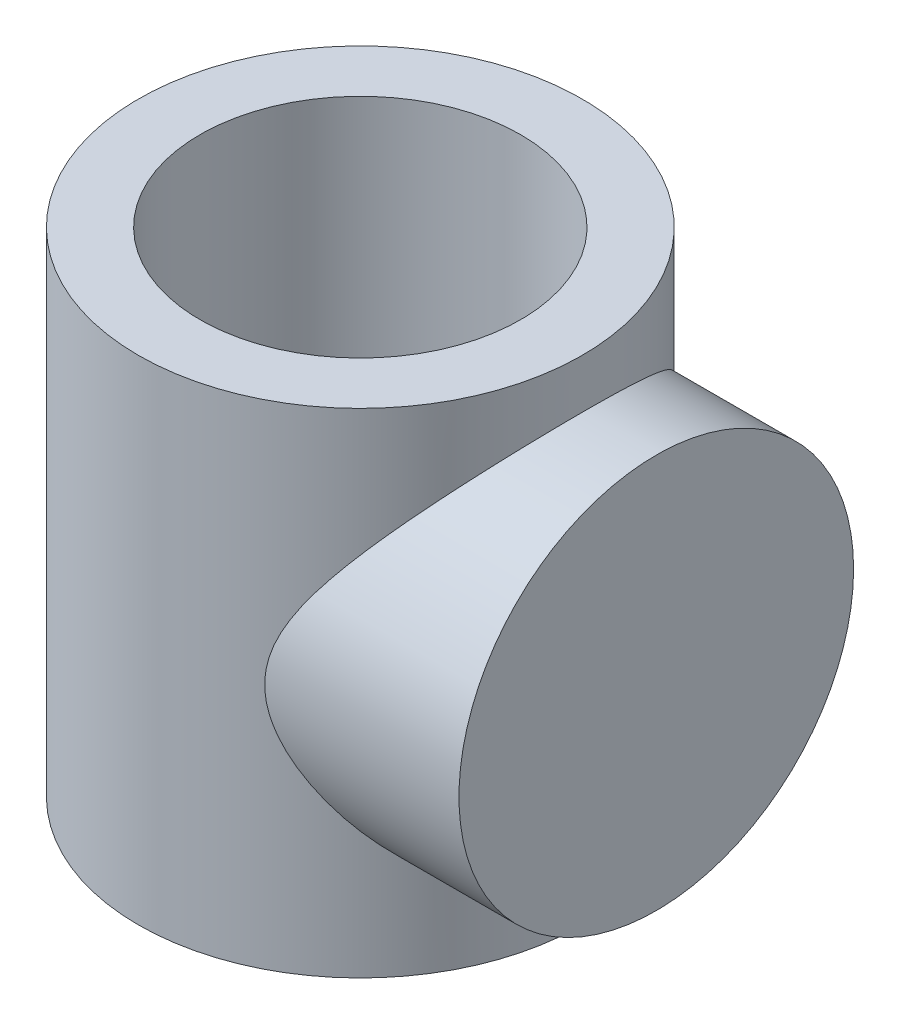
ISO-10303-21;
HEADER;
FILE_DESCRIPTION(('STEP AP214'),'2;1');
FILE_NAME('part.step','',(''),(''),'','','');
FILE_SCHEMA(('AUTOMOTIVE_DESIGN { 1 0 10303 214 1 1 1 1 }'));
ENDSEC;
DATA;
#1=APPLICATION_CONTEXT('core data for automotive mechanical design processes');
#2=APPLICATION_PROTOCOL_DEFINITION('international standard','automotive_design',2000,#1);
#3=PRODUCT_CONTEXT('',#1,'mechanical');
#4=PRODUCT('Part','Part','',(#3));
#5=PRODUCT_RELATED_PRODUCT_CATEGORY('part','',(#4));
#6=PRODUCT_DEFINITION_FORMATION('','',#4);
#7=PRODUCT_DEFINITION_CONTEXT('part definition',#1,'design');
#8=PRODUCT_DEFINITION('design','',#6,#7);
#9=PRODUCT_DEFINITION_SHAPE('','',#8);
#10=(LENGTH_UNIT() NAMED_UNIT(*) SI_UNIT(.MILLI.,.METRE.));
#11=(NAMED_UNIT(*) PLANE_ANGLE_UNIT() SI_UNIT($,.RADIAN.));
#12=(NAMED_UNIT(*) SI_UNIT($,.STERADIAN.) SOLID_ANGLE_UNIT());
#13=UNCERTAINTY_MEASURE_WITH_UNIT(LENGTH_MEASURE(1.E-05),#10,'distance_accuracy_value','');
#14=(GEOMETRIC_REPRESENTATION_CONTEXT(3) GLOBAL_UNCERTAINTY_ASSIGNED_CONTEXT((#13)) GLOBAL_UNIT_ASSIGNED_CONTEXT((#10,
#11,#12)) REPRESENTATION_CONTEXT('',''));
#15=CARTESIAN_POINT('',(0.,0.,0.));
#16=DIRECTION('',(0.,0.,1.));
#17=DIRECTION('',(1.,0.,0.));
#18=AXIS2_PLACEMENT_3D('',#15,#16,#17);
#19=CARTESIAN_POINT('',(0.,100.,0.));
#20=DIRECTION('',(0.,1.,0.));
#21=DIRECTION('',(0.,0.,1.));
#22=AXIS2_PLACEMENT_3D('',#19,#20,#21);
#23=PLANE('',#22);
#24=CARTESIAN_POINT('',(0.,100.,0.));
#25=DIRECTION('',(0.,1.,0.));
#26=DIRECTION('',(0.,0.,1.));
#27=AXIS2_PLACEMENT_3D('',#24,#25,#26);
#28=CIRCLE('',#27,45.);
#29=CARTESIAN_POINT('',(0.,100.,45.));
#30=VERTEX_POINT('',#29);
#31=EDGE_CURVE('E10',#30,#30,#28,.T.);
#32=ORIENTED_EDGE('',*,*,#31,.T.);
#33=EDGE_LOOP('',(#32));
#34=FACE_BOUND('',#33,.T.);
#35=CARTESIAN_POINT('',(0.,100.,0.));
#36=DIRECTION('',(0.,1.,0.));
#37=DIRECTION('',(0.,0.,1.));
#38=AXIS2_PLACEMENT_3D('',#35,#36,#37);
#39=CIRCLE('',#38,32.5);
#40=CARTESIAN_POINT('',(0.,100.,-32.5));
#41=VERTEX_POINT('',#40);
#42=EDGE_CURVE('E42',#41,#41,#39,.T.);
#43=ORIENTED_EDGE('',*,*,#42,.F.);
#44=EDGE_LOOP('',(#43));
#45=FACE_BOUND('',#44,.T.);
#46=ADVANCED_FACE('F31',(#34,#45),#23,.T.);
#47=CARTESIAN_POINT('',(0.,0.,0.));
#48=DIRECTION('',(0.,1.,0.));
#49=DIRECTION('',(0.,0.,1.));
#50=AXIS2_PLACEMENT_3D('',#47,#48,#49);
#51=PLANE('',#50);
#52=CARTESIAN_POINT('',(0.,0.,0.));
#53=DIRECTION('',(0.,1.,0.));
#54=DIRECTION('',(0.,0.,1.));
#55=AXIS2_PLACEMENT_3D('',#52,#53,#54);
#56=CIRCLE('',#55,45.);
#57=CARTESIAN_POINT('',(0.,0.,45.));
#58=VERTEX_POINT('',#57);
#59=EDGE_CURVE('E35',#58,#58,#56,.T.);
#60=ORIENTED_EDGE('',*,*,#59,.F.);
#61=EDGE_LOOP('',(#60));
#62=FACE_BOUND('',#61,.T.);
#63=CARTESIAN_POINT('',(0.,0.,0.));
#64=DIRECTION('',(0.,1.,0.));
#65=DIRECTION('',(0.,0.,1.));
#66=AXIS2_PLACEMENT_3D('',#63,#64,#65);
#67=CIRCLE('',#66,32.5);
#68=CARTESIAN_POINT('',(0.,0.,-32.5));
#69=VERTEX_POINT('',#68);
#70=EDGE_CURVE('E44',#69,#69,#67,.T.);
#71=ORIENTED_EDGE('',*,*,#70,.T.);
#72=EDGE_LOOP('',(#71));
#73=FACE_BOUND('',#72,.T.);
#74=ADVANCED_FACE('F74',(#62,#73),#51,.F.);
#75=CARTESIAN_POINT('',(0.,100.,0.));
#76=DIRECTION('',(0.,-1.,0.));
#77=DIRECTION('',(0.,0.,-1.));
#78=AXIS2_PLACEMENT_3D('',#75,#76,#77);
#79=CYLINDRICAL_SURFACE('',#78,45.);
#80=CARTESIAN_POINT('',(20.6155281280883,50.,-40.));
#81=CARTESIAN_POINT('',(20.615540418,50.6198197779686,-39.9999962251107));
#82=CARTESIAN_POINT('',(20.6436430981761,51.2396995798579,-39.9855479313317));
#83=CARTESIAN_POINT('',(20.7542540282698,52.4732354654713,-39.9282438286074));
#84=CARTESIAN_POINT('',(20.8367717550228,53.0868904461848,-39.8853830713871));
#85=CARTESIAN_POINT('',(21.0515804299819,54.3045947551819,-39.772422261382));
#86=CARTESIAN_POINT('',(21.1840159208184,54.9086108272,-39.7022430854551));
#87=CARTESIAN_POINT('',(21.4918714635343,56.1019007015422,-39.5364383520863));
#88=CARTESIAN_POINT('',(21.6672982867798,56.6911721653817,-39.4408087858668));
#89=CARTESIAN_POINT('',(22.1435909079244,58.1229754939491,-39.1760865644054));
#90=CARTESIAN_POINT('',(22.4648977500731,58.9561999886462,-38.9934932234162));
#91=CARTESIAN_POINT('',(23.1633993533042,60.5871236213774,-38.5826532613035));
#92=CARTESIAN_POINT('',(23.5406285943074,61.3848004444151,-38.3543784438762));
#93=CARTESIAN_POINT('',(24.3355887030968,62.9489659229656,-37.854989878743));
#94=CARTESIAN_POINT('',(24.7534436652381,63.715348176362,-37.5837431740612));
#95=CARTESIAN_POINT('',(25.6159451451714,65.2169059540972,-37.0012732230444));
#96=CARTESIAN_POINT('',(26.060588833819,65.952084759888,-36.6900541942516));
#97=CARTESIAN_POINT('',(26.8886325211995,67.2688375878823,-36.0862419485089));
#98=CARTESIAN_POINT('',(27.2693006232545,67.8549610434156,-35.7997595096417));
#99=CARTESIAN_POINT('',(28.0382809177628,69.0086873910974,-35.200743475365));
#100=CARTESIAN_POINT('',(28.4265939578924,69.5762882106875,-34.8882069784944));
#101=CARTESIAN_POINT('',(29.2074842358135,70.6938864746306,-34.2371359204103));
#102=CARTESIAN_POINT('',(29.6000636218341,71.2438744426008,-33.8985876861247));
#103=CARTESIAN_POINT('',(30.3862593349769,72.3262866987156,-33.1956822489631));
#104=CARTESIAN_POINT('',(30.7798756211747,72.8587116691469,-32.8313260504084));
#105=CARTESIAN_POINT('',(31.5650990231963,73.9055467293005,-32.0771028091511));
#106=CARTESIAN_POINT('',(31.9567078478011,74.4199756248537,-31.6872636975853));
#107=CARTESIAN_POINT('',(32.7359159978823,75.4311585651318,-30.8816137094185));
#108=CARTESIAN_POINT('',(33.1235152285058,75.9279121923976,-30.4658022200333));
#109=CARTESIAN_POINT('',(34.2765966289613,77.3906241131221,-29.1794403894786));
#110=CARTESIAN_POINT('',(35.0329237897876,78.3297741503471,-28.2694303630093));
#111=CARTESIAN_POINT('',(36.3287628878887,79.9154505648549,-26.5720844108783));
#112=CARTESIAN_POINT('',(36.8771457649083,80.5785430365209,-25.8068590321869));
#113=CARTESIAN_POINT('',(37.9418248281814,81.8544479265553,-24.2143528625236));
#114=CARTESIAN_POINT('',(38.4581217105724,82.4672614358682,-23.3870734187363));
#115=CARTESIAN_POINT('',(39.4499045560296,83.6361466255735,-21.6722146890276));
#116=CARTESIAN_POINT('',(39.9254463835031,84.1922961814658,-20.7847210325457));
#117=CARTESIAN_POINT('',(40.8281430053332,85.2421491550442,-18.9501226325183));
#118=CARTESIAN_POINT('',(41.2553079205523,85.7358656367912,-18.0030304222368));
#119=CARTESIAN_POINT('',(41.9760385315168,86.5653029213807,-16.2399802022856));
#120=CARTESIAN_POINT('',(42.2795076491055,86.9131578856554,-15.4337627767303));
#121=CARTESIAN_POINT('',(42.8446512428026,87.5591351302771,-13.7874208579418));
#122=CARTESIAN_POINT('',(43.1063302747541,87.8572628319145,-12.947300073288));
#123=CARTESIAN_POINT('',(43.5833700851011,88.3995673440432,-11.2373200746926));
#124=CARTESIAN_POINT('',(43.7987488339298,88.643765087267,-10.3674725510071));
#125=CARTESIAN_POINT('',(44.1792608642607,89.0745094075691,-8.60276228003229));
#126=CARTESIAN_POINT('',(44.3443935966026,89.2610553545463,-7.70789925945458));
#127=CARTESIAN_POINT('',(44.6218019371587,89.5741141323065,-5.89416229350235));
#128=CARTESIAN_POINT('',(44.7337678039064,89.7002752038037,-4.9751797832326));
#129=CARTESIAN_POINT('',(44.900928635567,89.8885356039749,-3.12551118754527));
#130=CARTESIAN_POINT('',(44.9561234665217,89.9506347814871,-2.19482507451685));
#131=CARTESIAN_POINT('',(45.0084556704374,90.0095146635087,-0.329952309489192));
#132=CARTESIAN_POINT('',(45.0056054924576,90.0063093740314,0.604233548939331));
#133=CARTESIAN_POINT('',(44.9419401256598,89.9346748751169,2.46806807865421));
#134=CARTESIAN_POINT('',(44.881128474091,89.8662496458955,3.39771702333762));
#135=CARTESIAN_POINT('',(44.7111606928339,89.6747982641384,5.15967211420565));
#136=CARTESIAN_POINT('',(44.6069573869694,89.5573637377636,5.99307708617168));
#137=CARTESIAN_POINT('',(44.3538532039027,89.2717287407403,7.64415793507384));
#138=CARTESIAN_POINT('',(44.2049556648061,89.1035320613906,8.46183498183971));
#139=CARTESIAN_POINT('',(43.8649985455303,88.7188094258707,10.0768587561612));
#140=CARTESIAN_POINT('',(43.6739329096967,88.5022765282064,10.8742025453437));
#141=CARTESIAN_POINT('',(43.2526851717915,88.0237774082421,12.4445253129939));
#142=CARTESIAN_POINT('',(43.0225006761344,87.7618084058,13.2175027971152));
#143=CARTESIAN_POINT('',(42.5111716285562,87.1782287501137,14.7823773823837));
#144=CARTESIAN_POINT('',(42.2277712551886,86.8539501752701,15.5725398517228));
#145=CARTESIAN_POINT('',(41.6248416261698,86.1615323406426,17.119038772943));
#146=CARTESIAN_POINT('',(41.3053119352847,85.7933925524791,17.8753748171788));
#147=CARTESIAN_POINT('',(40.6343117055167,85.0169310055714,19.3522772387937));
#148=CARTESIAN_POINT('',(40.2828420297423,84.6086103326033,20.0728445819309));
#149=CARTESIAN_POINT('',(39.5519526397212,83.7550820773832,21.4771922425932));
#150=CARTESIAN_POINT('',(39.1725270758837,83.3098667727208,22.160964808959));
#151=CARTESIAN_POINT('',(38.4831600865863,82.4959778735647,23.3322006241792));
#152=CARTESIAN_POINT('',(38.1782364766878,82.1343827034625,23.8275807341376));
#153=CARTESIAN_POINT('',(37.5562632705357,81.3928905890661,24.7963387709019));
#154=CARTESIAN_POINT('',(37.2392156463268,81.0129966185954,25.2697202484041));
#155=CARTESIAN_POINT('',(36.2719630061066,79.8470160629578,26.6573869156156));
#156=CARTESIAN_POINT('',(35.6058196974741,79.0348323152564,27.5389061197687));
#157=CARTESIAN_POINT('',(34.2412693425973,77.344382456872,29.2183328276433));
#158=CARTESIAN_POINT('',(33.5427369789989,76.465849657429,30.0158682757731));
#159=CARTESIAN_POINT('',(32.4828139902264,75.1040611211484,31.1469736002591));
#160=CARTESIAN_POINT('',(32.127490418236,74.6428065135917,31.5131379408867));
#161=CARTESIAN_POINT('',(31.414501226096,73.7057684613425,32.223941517518));
#162=CARTESIAN_POINT('',(31.0568357636962,73.2299859874965,32.5685821872064));
#163=CARTESIAN_POINT('',(30.3325132539646,72.2524527440457,33.244394978883));
#164=CARTESIAN_POINT('',(29.9658450426532,71.7503533326784,33.5750504406126));
#165=CARTESIAN_POINT('',(29.2342522404471,70.7308368381108,34.2139492693369));
#166=CARTESIAN_POINT('',(28.8693276736791,70.2134195436679,34.5221923270487));
#167=CARTESIAN_POINT('',(28.1434876477142,69.162475506928,35.1164383977693));
#168=CARTESIAN_POINT('',(27.7825756133319,68.6289362615522,35.4024235007923));
#169=CARTESIAN_POINT('',(27.0680545169524,67.545524697535,35.9516820175541));
#170=CARTESIAN_POINT('',(26.7144452624835,66.9956528102892,36.2149560304474));
#171=CARTESIAN_POINT('',(26.0198621511459,65.8815000879946,36.717155049933));
#172=CARTESIAN_POINT('',(25.6788335636271,65.3173059087389,36.9561961608582));
#173=CARTESIAN_POINT('',(25.0118215046925,64.1707003181641,37.4108495568829));
#174=CARTESIAN_POINT('',(24.6858399268859,63.5882866293778,37.626458897782));
#175=CARTESIAN_POINT('',(24.0548154269589,62.4050102914302,38.0329656049871));
#176=CARTESIAN_POINT('',(23.7497406507021,61.8041778228604,38.2239009769245));
#177=CARTESIAN_POINT('',(23.1666932116187,60.5822414165194,38.580058776311));
#178=CARTESIAN_POINT('',(22.8887095354669,59.9611458545089,38.7452916689932));
#179=CARTESIAN_POINT('',(22.4075363204889,58.7940572843391,39.0252180413047));
#180=CARTESIAN_POINT('',(22.1994042445698,58.2510406964499,39.1437760626281));
#181=CARTESIAN_POINT('',(21.8141212556573,57.1499471529874,39.3597880177022));
#182=CARTESIAN_POINT('',(21.6369674691856,56.5918715997998,39.4572439090404));
#183=CARTESIAN_POINT('',(21.3203155821724,55.4633418355636,39.6292393389877));
#184=CARTESIAN_POINT('',(21.1807088342442,54.8929286153896,39.7038450864389));
#185=CARTESIAN_POINT('',(20.944543588491,53.7405464493375,39.8289350002639));
#186=CARTESIAN_POINT('',(20.8479832521526,53.1585779980927,39.8794201968336));
#187=CARTESIAN_POINT('',(20.7020682850419,51.9801787709377,39.9553668390414));
#188=CARTESIAN_POINT('',(20.6532708498297,51.3836586102128,39.9805330085139));
#189=CARTESIAN_POINT('',(20.6077334025178,50.1881148864318,40.004025051665));
#190=CARTESIAN_POINT('',(20.6109897331183,49.5890915022089,40.0023528110114));
#191=CARTESIAN_POINT('',(20.6693870937567,48.3936054369046,39.9722087002464));
#192=CARTESIAN_POINT('',(20.724587993619,47.7971465085443,39.9437059059937));
#193=CARTESIAN_POINT('',(20.8837124973085,46.6126236311458,39.8607383950903));
#194=CARTESIAN_POINT('',(20.9876452069245,46.0245612722199,39.8062688263826));
#195=CARTESIAN_POINT('',(21.2648124549145,44.7405076006067,39.6590107681955));
#196=CARTESIAN_POINT('',(21.4479254173585,44.0473028111194,39.5606324138645));
#197=CARTESIAN_POINT('',(21.8660432993698,42.6824339455547,39.3310662231226));
#198=CARTESIAN_POINT('',(22.1010652584659,42.0107770258373,39.1998676113294));
#199=CARTESIAN_POINT('',(22.612807069387,40.6880558672419,38.9069158454174));
#200=CARTESIAN_POINT('',(22.8896582748847,40.0370646052942,38.745066018456));
#201=CARTESIAN_POINT('',(23.4749245285428,38.7574045468746,38.393286708736));
#202=CARTESIAN_POINT('',(23.7833400741315,38.1287361024025,38.203356783437));
#203=CARTESIAN_POINT('',(24.3948405325123,36.9485951774587,37.8154834908338));
#204=CARTESIAN_POINT('',(24.6958715056541,36.3952929401827,37.6198296096384));
#205=CARTESIAN_POINT('',(25.312860129201,35.3050031797534,37.2074833203753));
#206=CARTESIAN_POINT('',(25.6288203228668,34.7680184621514,36.9907873210047));
#207=CARTESIAN_POINT('',(26.2719276585805,33.7091700984873,36.5368425814769));
#208=CARTESIAN_POINT('',(26.5990818411204,33.1873163649066,36.2995807570268));
#209=CARTESIAN_POINT('',(27.261161782341,32.1583066651119,35.8050248991153));
#210=CARTESIAN_POINT('',(27.596087129102,31.6511499230569,35.5477319257334));
#211=CARTESIAN_POINT('',(28.2715297631597,30.650168171572,35.012946806931));
#212=CARTESIAN_POINT('',(28.612054375072,30.1563633051795,34.7354262480996));
#213=CARTESIAN_POINT('',(29.2959586270617,29.1823778622962,34.1605970780592));
#214=CARTESIAN_POINT('',(29.6393384918895,28.7021983717052,33.8632868959616));
#215=CARTESIAN_POINT('',(30.3268063000329,27.7554254751733,33.2490180787441));
#216=CARTESIAN_POINT('',(30.6708939374364,27.2888271506028,32.9320666904645));
#217=CARTESIAN_POINT('',(31.3581255438788,26.3689754718282,32.2783676142772));
#218=CARTESIAN_POINT('',(31.7012694313471,25.9157232402126,31.9416182681894));
#219=CARTESIAN_POINT('',(32.7763301370345,24.5113960106248,30.851287051591));
#220=CARTESIAN_POINT('',(33.5036998995461,23.5842965847261,30.0617597662886));
#221=CARTESIAN_POINT('',(34.9317285031401,21.7951224957041,28.389862453425));
#222=CARTESIAN_POINT('',(35.6323813577003,20.9330623642368,27.5074717823535));
#223=CARTESIAN_POINT('',(36.9912777691704,19.2823587953311,25.6508215267983));
#224=CARTESIAN_POINT('',(37.6496221002191,18.493538749214,24.6767949777944));
#225=CARTESIAN_POINT('',(38.59540737567,17.3710904885716,23.1463670705089));
#226=CARTESIAN_POINT('',(38.9036700413261,17.0071223119882,22.6247447039453));
#227=CARTESIAN_POINT('',(39.5046269291929,16.3005915235085,21.5582720125565));
#228=CARTESIAN_POINT('',(39.7973175760656,15.9580338243328,21.0134164046652));
#229=CARTESIAN_POINT('',(40.4729832116625,15.1701621678677,19.6895932636228));
#230=CARTESIAN_POINT('',(40.8480229445893,14.7352408570451,18.9003114496453));
#231=CARTESIAN_POINT('',(41.5592471631573,13.913808437127,17.2803717040477));
#232=CARTESIAN_POINT('',(41.895442149045,13.5272842432787,16.4497250411771));
#233=CARTESIAN_POINT('',(42.5236732159304,12.8073437092959,14.7498416442274));
#234=CARTESIAN_POINT('',(42.8157241451348,12.4739095098935,13.8806180136484));
#235=CARTESIAN_POINT('',(43.3505552801983,11.864820939531,12.1073078364812));
#236=CARTESIAN_POINT('',(43.5933343128586,11.5891679443776,11.2032204603722));
#237=CARTESIAN_POINT('',(44.0264760841714,11.0982769623553,9.35812389154025));
#238=CARTESIAN_POINT('',(44.2163967391805,10.8835482452286,8.41687432431224));
#239=CARTESIAN_POINT('',(44.5368843529423,10.5216370109414,6.51145764497639));
#240=CARTESIAN_POINT('',(44.6674513040988,10.3744545024256,5.54729052993551));
#241=CARTESIAN_POINT('',(44.8659899498969,10.1507878522737,3.60491672120102));
#242=CARTESIAN_POINT('',(44.9339966656085,10.0742641559136,2.62671819413392));
#243=CARTESIAN_POINT('',(45.0057851033506,9.99348737925125,0.665037480815485));
#244=CARTESIAN_POINT('',(45.0095740792959,9.98922613631843,-0.318444096118149));
#245=CARTESIAN_POINT('',(44.9563238116083,10.049140568255,-2.16174114724054));
#246=CARTESIAN_POINT('',(44.9066222545645,10.1050606971846,-3.02205789057127));
#247=CARTESIAN_POINT('',(44.7586333720177,10.2717136297829,-4.73306515491628));
#248=CARTESIAN_POINT('',(44.6603507533943,10.3824411233247,-5.58375660033214));
#249=CARTESIAN_POINT('',(44.4170734614649,10.6568882570753,-7.2697446913342));
#250=CARTESIAN_POINT('',(44.2720769398106,10.8206099941305,-8.10504072638099));
#251=CARTESIAN_POINT('',(43.9379834631066,11.1985285314947,-9.75511727192182));
#252=CARTESIAN_POINT('',(43.7488844197022,11.412727722031,-10.569896808888));
#253=CARTESIAN_POINT('',(43.3280219555266,11.8905472846058,-12.1812003950835));
#254=CARTESIAN_POINT('',(43.0959208902301,12.1545591012893,-12.9775195544776));
#255=CARTESIAN_POINT('',(42.59369139546,12.7274693228479,-14.5413893324117));
#256=CARTESIAN_POINT('',(42.3235639332306,13.0363665860176,-15.3089406820648));
#257=CARTESIAN_POINT('',(41.7489687954013,13.695695271657,-16.8128469499724));
#258=CARTESIAN_POINT('',(41.4444932677004,14.0461361921025,-17.5491946818191));
#259=CARTESIAN_POINT('',(40.8049558688859,14.7852479489484,-18.9888418932709));
#260=CARTESIAN_POINT('',(40.4698876285412,15.173926747572,-19.6921344445939));
#261=CARTESIAN_POINT('',(39.8640484527772,15.880121450499,-20.8849414711539));
#262=CARTESIAN_POINT('',(39.5993551016005,16.1896931942304,-21.3822958781582));
#263=CARTESIAN_POINT('',(39.0568613745728,16.8267238144047,-22.3578414061017));
#264=CARTESIAN_POINT('',(38.7790633047007,17.1541795454701,-22.8360358713449));
#265=CARTESIAN_POINT('',(37.9278166871154,18.1621422976869,-24.2421392642115));
#266=CARTESIAN_POINT('',(37.3366387525121,18.8681020193604,-25.14132841594));
#267=CARTESIAN_POINT('',(36.1169657417535,20.3418328795509,-26.8641327812388));
#268=CARTESIAN_POINT('',(35.4883898901027,21.1097391895338,-27.6875738497618));
#269=CARTESIAN_POINT('',(34.2057785783045,22.7006076846106,-29.2573370872594));
#270=CARTESIAN_POINT('',(33.5517466819026,23.5235621746864,-30.0036699979898));
#271=CARTESIAN_POINT('',(32.2145886829656,25.2396244658512,-31.4356459293877));
#272=CARTESIAN_POINT('',(31.5311393446806,26.1338614955235,-32.1196355362179));
#273=CARTESIAN_POINT('',(30.5039381096333,27.5147986693148,-33.0867248358593));
#274=CARTESIAN_POINT('',(30.1611259289374,27.9818126300982,-33.3993329374623));
#275=CARTESIAN_POINT('',(29.476609627204,28.9292154366275,-34.0049732879994));
#276=CARTESIAN_POINT('',(29.134905516816,29.4096044104958,-34.2980053493189));
#277=CARTESIAN_POINT('',(28.4550810223778,30.3833495675459,-34.864075668474));
#278=CARTESIAN_POINT('',(28.1169565634396,30.8766881156435,-35.1371393768324));
#279=CARTESIAN_POINT('',(27.446158910073,31.8773751782259,-35.663568238877));
#280=CARTESIAN_POINT('',(27.1134855506235,32.3847232673468,-35.916933989752));
#281=CARTESIAN_POINT('',(26.4565064830083,33.4137556189853,-36.403574537372));
#282=CARTESIAN_POINT('',(26.1321955767832,33.935430538111,-36.6368620363493));
#283=CARTESIAN_POINT('',(25.4949364795967,34.9943141625912,-37.0831436313614));
#284=CARTESIAN_POINT('',(25.1819898138377,35.53152493577,-37.2961350096245));
#285=CARTESIAN_POINT('',(24.5445211957299,36.6704982961451,-37.7190309923816));
#286=CARTESIAN_POINT('',(24.221412071151,37.2737757597333,-37.9270071026157));
#287=CARTESIAN_POINT('',(23.5997689096397,38.500920313227,-38.3169083906622));
#288=CARTESIAN_POINT('',(23.3012271064216,39.1247808083247,-38.4988418147101));
#289=CARTESIAN_POINT('',(22.7368852870787,40.3933297864714,-38.8348003309022));
#290=CARTESIAN_POINT('',(22.4710334897539,41.0379832337474,-38.9888697469814));
#291=CARTESIAN_POINT('',(21.9810032898514,42.3492634084526,-39.2672253903339));
#292=CARTESIAN_POINT('',(21.7568116077767,43.0158830539351,-39.3915211118763));
#293=CARTESIAN_POINT('',(21.4100356213917,44.20121102854,-39.5807930069095));
#294=CARTESIAN_POINT('',(21.2760493916982,44.7154512427973,-39.6528337483545));
#295=CARTESIAN_POINT('',(21.0421693882525,45.7539852526712,-39.7774398211678));
#296=CARTESIAN_POINT('',(20.9422707036229,46.2782775886081,-39.8300079579818));
#297=CARTESIAN_POINT('',(20.7807460575877,47.3334417896235,-39.914520832691));
#298=CARTESIAN_POINT('',(20.7190491078785,47.8642995699237,-39.9465038272834));
#299=CARTESIAN_POINT('',(20.6364334739522,48.9300898144622,-39.9892457506582));
#300=CARTESIAN_POINT('',(20.6155175204474,49.4650225491535,-40.0000032581739));
#301=CARTESIAN_POINT('',(20.6155281280883,50.,-40.));
#302=B_SPLINE_CURVE_WITH_KNOTS('',3,(#80,#81,#82,#83,#84,#85,#86,#87,#88,#89,#90,#91,#92,#93,
#94,#95,#96,#97,#98,#99,#100,#101,#102,#103,#104,#105,#106,#107,#108,#109,#110,#111,#112,#113,
#114,#115,#116,#117,#118,#119,#120,#121,#122,#123,#124,#125,#126,#127,#128,#129,#130,#131,#132,
#133,#134,#135,#136,#137,#138,#139,#140,#141,#142,#143,#144,#145,#146,#147,#148,#149,#150,#151,
#152,#153,#154,#155,#156,#157,#158,#159,#160,#161,#162,#163,#164,#165,#166,#167,#168,#169,#170,
#171,#172,#173,#174,#175,#176,#177,#178,#179,#180,#181,#182,#183,#184,#185,#186,#187,#188,#189,
#190,#191,#192,#193,#194,#195,#196,#197,#198,#199,#200,#201,#202,#203,#204,#205,#206,#207,#208,
#209,#210,#211,#212,#213,#214,#215,#216,#217,#218,#219,#220,#221,#222,#223,#224,#225,#226,#227,
#228,#229,#230,#231,#232,#233,#234,#235,#236,#237,#238,#239,#240,#241,#242,#243,#244,#245,#246,
#247,#248,#249,#250,#251,#252,#253,#254,#255,#256,#257,#258,#259,#260,#261,#262,#263,#264,#265,
#266,#267,#268,#269,#270,#271,#272,#273,#274,#275,#276,#277,#278,#279,#280,#281,#282,#283,#284,
#285,#286,#287,#288,#289,#290,#291,#292,#293,#294,#295,#296,#297,#298,#299,#300,#301),
.UNSPECIFIED.,.T.,.F.,(4,2,2,2,2,2,2,2,2,2,2,2,2,2,2,2,2,2,2,2,2,2,2,2,2,2,2,2,2,2,2,2,2,2,2,2,
2,2,2,2,2,2,2,2,2,2,2,2,2,2,2,2,2,2,2,2,2,2,2,2,2,2,2,2,2,2,2,2,2,2,2,2,2,2,2,2,2,2,2,2,2,2,2,2,
2,2,2,2,2,2,2,2,2,2,2,2,2,2,2,2,2,2,2,2,2,2,2,2,2,2,4),(0.,1.85878673674422,3.71789728227376,
5.58243297585692,7.44726253279771,10.177070596863,12.908568825907,15.6486897091744,
18.388521715164,20.6537919125622,22.919314715378,25.1860366467276,27.4526704166068,
29.7168601489529,31.9811033220796,36.506386581397,39.9581528033861,43.4098441097088,
46.8567257508562,50.3028849376305,53.0873112738003,55.8714338517568,58.6544738751292,
61.4375443144559,64.2366353656004,67.0357330215263,69.8342303542619,72.6325569123862,
75.1738877044481,77.715028737789,80.2565349357424,82.7981966981449,85.4953198703959,
88.19247553716,90.8895583408292,93.5872071033517,95.6412924118529,97.6950450202817,
101.803719767694,105.929891711044,107.992922520611,110.055815765486,112.167867345722,
114.279948065964,116.393711080531,118.507418313621,120.610465357353,122.713776344043,
124.813807945401,126.912982229701,128.692304249413,130.471461135454,132.245413007792,
134.019289107337,135.813620759894,137.607826343186,139.404102412669,141.200714259396,
143.368293830769,145.536585987145,147.711834321801,149.887116941874,151.865090656929,
153.843402552291,155.822982450196,157.802457656786,159.784769079663,161.767238045331,
163.748979862631,165.730887898037,169.981190967602,174.232440882432,178.473157701558,
180.592868823105,182.713064548768,185.638594046055,188.563330874886,191.487081745388,
194.410902224313,197.358487773319,200.306073699566,203.252008568364,206.197610667689,
208.785175011057,211.372488701867,213.959904778566,216.547443400193,219.15623330393,
221.76495686214,224.374277997804,226.984143623658,228.912032882934,230.839584156437,
234.695598469488,238.560267094486,242.424396613601,246.371754335315,248.346282138723,
250.320828863081,252.292813419637,254.264738167625,256.235406091054,258.206337528951,
260.35107262696,262.495127100114,264.635740387235,266.775670161775,268.383141932898,
269.990382023121,271.594626427939,273.198978249931),.UNSPECIFIED.);
#303=CARTESIAN_POINT('',(20.6155281280883,50.,-40.));
#304=VERTEX_POINT('',#303);
#305=EDGE_CURVE('E47',#304,#304,#302,.T.);
#306=ORIENTED_EDGE('',*,*,#305,.F.);
#307=EDGE_LOOP('',(#306));
#308=FACE_BOUND('',#307,.T.);
#309=ORIENTED_EDGE('',*,*,#31,.F.);
#310=EDGE_LOOP('',(#309));
#311=FACE_BOUND('',#310,.T.);
#312=ORIENTED_EDGE('',*,*,#59,.T.);
#313=EDGE_LOOP('',(#312));
#314=FACE_BOUND('',#313,.T.);
#315=ADVANCED_FACE('F33',(#308,#311,#314),#79,.T.);
#316=CARTESIAN_POINT('',(0.,100.,0.));
#317=DIRECTION('',(0.,-1.,0.));
#318=DIRECTION('',(0.,0.,-1.));
#319=AXIS2_PLACEMENT_3D('',#316,#317,#318);
#320=CYLINDRICAL_SURFACE('',#319,32.5);
#321=CARTESIAN_POINT('',(0.,100.,-32.5));
#322=CARTESIAN_POINT('',(0.,98.9583333333333,-32.5));
#323=CARTESIAN_POINT('',(0.,97.9166666666667,-32.5));
#324=CARTESIAN_POINT('',(0.,95.8333333333333,-32.5));
#325=CARTESIAN_POINT('',(0.,94.7916666666666,-32.5));
#326=CARTESIAN_POINT('',(0.,92.7083333333333,-32.5));
#327=CARTESIAN_POINT('',(0.,91.6666666666666,-32.5));
#328=CARTESIAN_POINT('',(0.,89.5833333333333,-32.5));
#329=CARTESIAN_POINT('',(0.,88.5416666666667,-32.5));
#330=CARTESIAN_POINT('',(0.,86.4583333333333,-32.5));
#331=CARTESIAN_POINT('',(0.,85.4166666666667,-32.5));
#332=CARTESIAN_POINT('',(0.,83.3333333333333,-32.5));
#333=CARTESIAN_POINT('',(0.,82.2916666666667,-32.5));
#334=CARTESIAN_POINT('',(0.,80.2083333333333,-32.5));
#335=CARTESIAN_POINT('',(0.,79.1666666666666,-32.5));
#336=CARTESIAN_POINT('',(0.,77.0833333333333,-32.5));
#337=CARTESIAN_POINT('',(0.,76.0416666666666,-32.5));
#338=CARTESIAN_POINT('',(0.,73.9583333333333,-32.5));
#339=CARTESIAN_POINT('',(0.,72.9166666666667,-32.5));
#340=CARTESIAN_POINT('',(0.,70.8333333333333,-32.5));
#341=CARTESIAN_POINT('',(0.,69.7916666666667,-32.5));
#342=CARTESIAN_POINT('',(0.,67.7083333333333,-32.5));
#343=CARTESIAN_POINT('',(0.,66.6666666666667,-32.5));
#344=CARTESIAN_POINT('',(0.,64.5833333333333,-32.5));
#345=CARTESIAN_POINT('',(0.,63.5416666666667,-32.5));
#346=CARTESIAN_POINT('',(0.,61.4583333333333,-32.5));
#347=CARTESIAN_POINT('',(0.,60.4166666666667,-32.5));
#348=CARTESIAN_POINT('',(0.,58.3333333333333,-32.5));
#349=CARTESIAN_POINT('',(0.,57.2916666666667,-32.5));
#350=CARTESIAN_POINT('',(0.,55.2083333333333,-32.5));
#351=CARTESIAN_POINT('',(0.,54.1666666666667,-32.5));
#352=CARTESIAN_POINT('',(0.,52.0833333333333,-32.5));
#353=CARTESIAN_POINT('',(0.,51.0416666666667,-32.5));
#354=CARTESIAN_POINT('',(0.,48.9583333333333,-32.5));
#355=CARTESIAN_POINT('',(0.,47.9166666666667,-32.5));
#356=CARTESIAN_POINT('',(0.,45.8333333333333,-32.5));
#357=CARTESIAN_POINT('',(0.,44.7916666666667,-32.5));
#358=CARTESIAN_POINT('',(0.,42.7083333333333,-32.5));
#359=CARTESIAN_POINT('',(0.,41.6666666666667,-32.5));
#360=CARTESIAN_POINT('',(0.,39.5833333333333,-32.5));
#361=CARTESIAN_POINT('',(0.,38.5416666666667,-32.5));
#362=CARTESIAN_POINT('',(0.,36.4583333333333,-32.5));
#363=CARTESIAN_POINT('',(0.,35.4166666666667,-32.5));
#364=CARTESIAN_POINT('',(0.,33.3333333333333,-32.5));
#365=CARTESIAN_POINT('',(0.,32.2916666666667,-32.5));
#366=CARTESIAN_POINT('',(0.,30.2083333333333,-32.5));
#367=CARTESIAN_POINT('',(0.,29.1666666666667,-32.5));
#368=CARTESIAN_POINT('',(0.,27.0833333333333,-32.5));
#369=CARTESIAN_POINT('',(0.,26.0416666666667,-32.5));
#370=CARTESIAN_POINT('',(0.,23.9583333333333,-32.5));
#371=CARTESIAN_POINT('',(0.,22.9166666666667,-32.5));
#372=CARTESIAN_POINT('',(0.,20.8333333333333,-32.5));
#373=CARTESIAN_POINT('',(0.,19.7916666666667,-32.5));
#374=CARTESIAN_POINT('',(0.,17.7083333333333,-32.5));
#375=CARTESIAN_POINT('',(0.,16.6666666666667,-32.5));
#376=CARTESIAN_POINT('',(0.,14.5833333333333,-32.5));
#377=CARTESIAN_POINT('',(0.,13.5416666666667,-32.5));
#378=CARTESIAN_POINT('',(0.,11.4583333333333,-32.5));
#379=CARTESIAN_POINT('',(0.,10.4166666666667,-32.5));
#380=CARTESIAN_POINT('',(0.,8.33333333333333,-32.5));
#381=CARTESIAN_POINT('',(0.,7.29166666666667,-32.5));
#382=CARTESIAN_POINT('',(0.,5.20833333333334,-32.5));
#383=CARTESIAN_POINT('',(0.,4.16666666666667,-32.5));
#384=CARTESIAN_POINT('',(0.,2.08333333333334,-32.5));
#385=CARTESIAN_POINT('',(0.,1.04166666666667,-32.5));
#386=CARTESIAN_POINT('',(0.,0.,-32.5));
#387=B_SPLINE_CURVE_WITH_KNOTS('',3,(#321,#322,#323,#324,#325,#326,#327,#328,#329,#330,#331,
#332,#333,#334,#335,#336,#337,#338,#339,#340,#341,#342,#343,#344,#345,#346,#347,#348,#349,#350,
#351,#352,#353,#354,#355,#356,#357,#358,#359,#360,#361,#362,#363,#364,#365,#366,#367,#368,#369,
#370,#371,#372,#373,#374,#375,#376,#377,#378,#379,#380,#381,#382,#383,#384,#385,#386),
.UNSPECIFIED.,.F.,.F.,(4,2,2,2,2,2,2,2,2,2,2,2,2,2,2,2,2,2,2,2,2,2,2,2,2,2,2,2,2,2,2,2,4),(0.,
3.12499999999999,6.24999999999999,9.37499999999999,12.5,15.625,18.75,21.875,25.,28.125,31.25,
34.375,37.5,40.625,43.75,46.875,50.,53.125,56.25,59.375,62.5,65.625,68.75,71.875,75.,78.125,
81.25,84.375,87.5,90.625,93.75,96.875,100.),.UNSPECIFIED.);
#388=EDGE_CURVE('BSEAM64',#41,#69,#387,.T.);
#389=ORIENTED_EDGE('',*,*,#42,.T.);
#390=ORIENTED_EDGE('',*,*,#70,.F.);
#391=ORIENTED_EDGE('',*,*,#388,.T.);
#392=ORIENTED_EDGE('',*,*,#388,.F.);
#393=EDGE_LOOP('',(#389,#391,#390,#392));
#394=FACE_BOUND('',#393,.T.);
#395=ADVANCED_FACE('F64',(#394),#320,.F.);
#396=CARTESIAN_POINT('',(60.,50.,0.));
#397=DIRECTION('',(1.,0.,0.));
#398=DIRECTION('',(0.,0.,-1.));
#399=AXIS2_PLACEMENT_3D('',#396,#397,#398);
#400=PLANE('',#399);
#401=CARTESIAN_POINT('',(60.,50.,0.));
#402=DIRECTION('',(1.,0.,0.));
#403=DIRECTION('',(0.,0.,-1.));
#404=AXIS2_PLACEMENT_3D('',#401,#402,#403);
#405=CIRCLE('',#404,40.);
#406=CARTESIAN_POINT('',(60.,50.,-40.));
#407=VERTEX_POINT('',#406);
#408=EDGE_CURVE('E56',#407,#407,#405,.T.);
#409=ORIENTED_EDGE('',*,*,#408,.T.);
#410=EDGE_LOOP('',(#409));
#411=FACE_BOUND('',#410,.T.);
#412=ADVANCED_FACE('F62',(#411),#400,.T.);
#413=CARTESIAN_POINT('',(-45.001,50.,0.));
#414=DIRECTION('',(1.,0.,0.));
#415=DIRECTION('',(0.,0.,-1.));
#416=AXIS2_PLACEMENT_3D('',#413,#414,#415);
#417=CYLINDRICAL_SURFACE('',#416,40.);
#418=ORIENTED_EDGE('',*,*,#408,.F.);
#419=EDGE_LOOP('',(#418));
#420=FACE_BOUND('',#419,.T.);
#421=ORIENTED_EDGE('',*,*,#305,.T.);
#422=EDGE_LOOP('',(#421));
#423=FACE_BOUND('',#422,.T.);
#424=ADVANCED_FACE('F57',(#420,#423),#417,.T.);
#425=CLOSED_SHELL('',(#46,#74,#315,#395,#412,#424));
#426=MANIFOLD_SOLID_BREP('B2',#425);
#427=ADVANCED_BREP_SHAPE_REPRESENTATION('',(#18,#426),#14);
#428=SHAPE_DEFINITION_REPRESENTATION(#9,#427);
ENDSEC;
END-ISO-10303-21;
